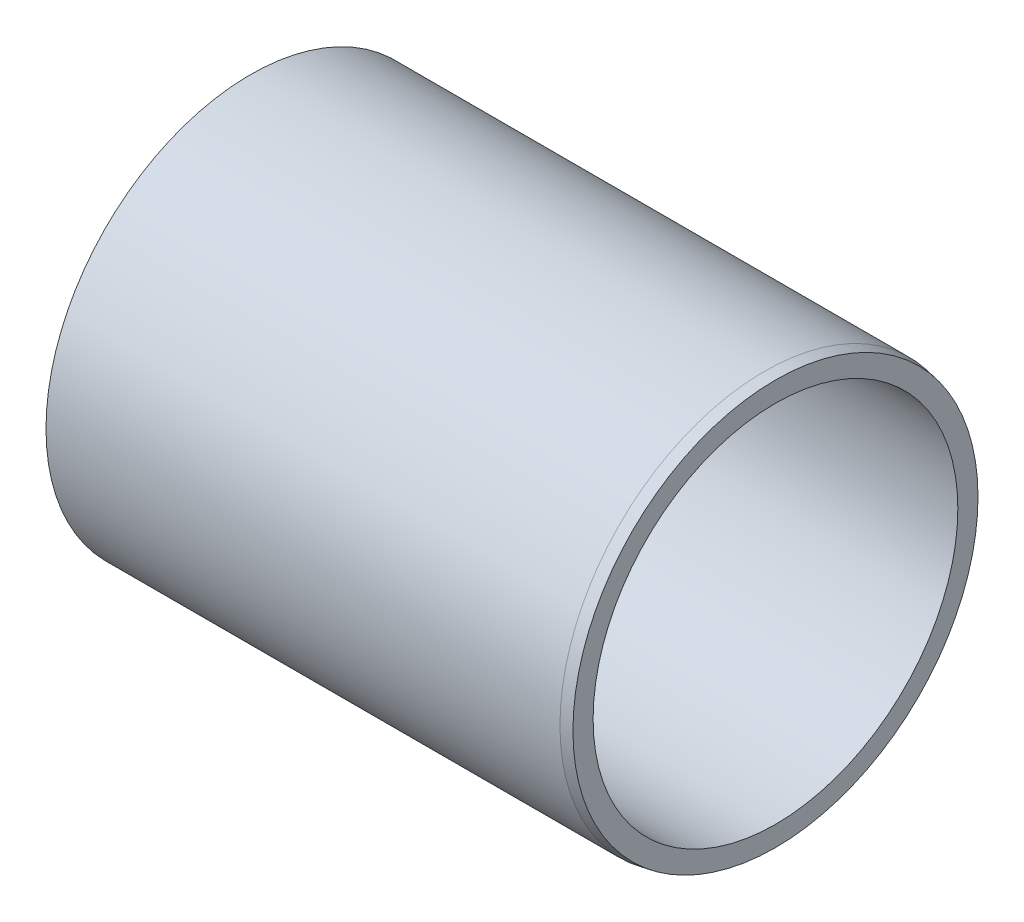
ISO-10303-21;
HEADER;
FILE_DESCRIPTION(('STEP AP214'),'2;1');
FILE_NAME('part.step','',(''),(''),'','','');
FILE_SCHEMA(('AUTOMOTIVE_DESIGN { 1 0 10303 214 1 1 1 1 }'));
ENDSEC;
DATA;
#1=APPLICATION_CONTEXT('core data for automotive mechanical design processes');
#2=APPLICATION_PROTOCOL_DEFINITION('international standard','automotive_design',2000,#1);
#3=PRODUCT_CONTEXT('',#1,'mechanical');
#4=PRODUCT('Part','Part','',(#3));
#5=PRODUCT_RELATED_PRODUCT_CATEGORY('part','',(#4));
#6=PRODUCT_DEFINITION_FORMATION('','',#4);
#7=PRODUCT_DEFINITION_CONTEXT('part definition',#1,'design');
#8=PRODUCT_DEFINITION('design','',#6,#7);
#9=PRODUCT_DEFINITION_SHAPE('','',#8);
#10=(LENGTH_UNIT() NAMED_UNIT(*) SI_UNIT(.MILLI.,.METRE.));
#11=(NAMED_UNIT(*) PLANE_ANGLE_UNIT() SI_UNIT($,.RADIAN.));
#12=(NAMED_UNIT(*) SI_UNIT($,.STERADIAN.) SOLID_ANGLE_UNIT());
#13=UNCERTAINTY_MEASURE_WITH_UNIT(LENGTH_MEASURE(1.E-05),#10,'distance_accuracy_value','');
#14=(GEOMETRIC_REPRESENTATION_CONTEXT(3) GLOBAL_UNCERTAINTY_ASSIGNED_CONTEXT((#13)) GLOBAL_UNIT_ASSIGNED_CONTEXT((#10,
#11,#12)) REPRESENTATION_CONTEXT('',''));
#15=CARTESIAN_POINT('',(0.,0.,0.));
#16=DIRECTION('',(0.,0.,1.));
#17=DIRECTION('',(1.,0.,0.));
#18=AXIS2_PLACEMENT_3D('',#15,#16,#17);
#19=CARTESIAN_POINT('',(0.,33.,0.));
#20=DIRECTION('',(1.,0.,0.));
#21=DIRECTION('',(0.,0.,-1.));
#22=AXIS2_PLACEMENT_3D('',#19,#20,#21);
#23=PLANE('',#22);
#24=CARTESIAN_POINT('',(0.,0.,0.));
#25=DIRECTION('',(-1.,0.,0.));
#26=DIRECTION('',(0.,0.,1.));
#27=AXIS2_PLACEMENT_3D('',#24,#25,#26);
#28=CIRCLE('',#27,33.);
#29=CARTESIAN_POINT('',(0.,0.,33.));
#30=VERTEX_POINT('',#29);
#31=EDGE_CURVE('E55',#30,#30,#28,.T.);
#32=ORIENTED_EDGE('',*,*,#31,.F.);
#33=EDGE_LOOP('',(#32));
#34=FACE_BOUND('',#33,.T.);
#35=CARTESIAN_POINT('',(0.,0.,0.));
#36=DIRECTION('',(-1.,0.,0.));
#37=DIRECTION('',(0.,0.,1.));
#38=AXIS2_PLACEMENT_3D('',#35,#36,#37);
#39=CIRCLE('',#38,37.);
#40=CARTESIAN_POINT('',(0.,0.,37.));
#41=VERTEX_POINT('',#40);
#42=EDGE_CURVE('E10',#41,#41,#39,.T.);
#43=ORIENTED_EDGE('',*,*,#42,.T.);
#44=EDGE_LOOP('',(#43));
#45=FACE_BOUND('',#44,.T.);
#46=ADVANCED_FACE('F36',(#34,#45),#23,.F.);
#47=CARTESIAN_POINT('',(0.,0.,0.));
#48=DIRECTION('',(-1.,0.,0.));
#49=DIRECTION('',(0.,0.,1.));
#50=AXIS2_PLACEMENT_3D('',#47,#48,#49);
#51=CYLINDRICAL_SURFACE('',#50,37.);
#52=ORIENTED_EDGE('',*,*,#42,.F.);
#53=EDGE_LOOP('',(#52));
#54=FACE_BOUND('',#53,.T.);
#55=CARTESIAN_POINT('',(93.,0.,0.));
#56=DIRECTION('',(-1.,0.,0.));
#57=DIRECTION('',(0.,0.,1.));
#58=AXIS2_PLACEMENT_3D('',#55,#56,#57);
#59=CIRCLE('',#58,37.);
#60=CARTESIAN_POINT('',(93.,0.,37.));
#61=VERTEX_POINT('',#60);
#62=EDGE_CURVE('E42',#61,#61,#59,.T.);
#63=ORIENTED_EDGE('',*,*,#62,.T.);
#64=EDGE_LOOP('',(#63));
#65=FACE_BOUND('',#64,.T.);
#66=ADVANCED_FACE('F62',(#54,#65),#51,.T.);
#67=CARTESIAN_POINT('',(95.,0.,0.));
#68=DIRECTION('',(-1.,0.,0.));
#69=DIRECTION('',(0.,0.,1.));
#70=AXIS2_PLACEMENT_3D('',#67,#68,#69);
#71=CONICAL_SURFACE('',#70,36.6473460385831,0.174532925199435);
#72=ORIENTED_EDGE('',*,*,#62,.F.);
#73=EDGE_LOOP('',(#72));
#74=FACE_BOUND('',#73,.T.);
#75=CARTESIAN_POINT('',(95.,0.,0.));
#76=DIRECTION('',(-1.,0.,0.));
#77=DIRECTION('',(0.,0.,1.));
#78=AXIS2_PLACEMENT_3D('',#75,#76,#77);
#79=CIRCLE('',#78,36.6473460385831);
#80=CARTESIAN_POINT('',(95.,0.,36.6473460385831));
#81=VERTEX_POINT('',#80);
#82=EDGE_CURVE('E46',#81,#81,#79,.T.);
#83=ORIENTED_EDGE('',*,*,#82,.T.);
#84=EDGE_LOOP('',(#83));
#85=FACE_BOUND('',#84,.T.);
#86=ADVANCED_FACE('F66',(#74,#85),#71,.T.);
#87=CARTESIAN_POINT('',(95.,33.,0.));
#88=DIRECTION('',(-1.,0.,0.));
#89=DIRECTION('',(0.,0.,1.));
#90=AXIS2_PLACEMENT_3D('',#87,#88,#89);
#91=PLANE('',#90);
#92=ORIENTED_EDGE('',*,*,#82,.F.);
#93=EDGE_LOOP('',(#92));
#94=FACE_BOUND('',#93,.T.);
#95=CARTESIAN_POINT('',(95.,0.,0.));
#96=DIRECTION('',(-1.,0.,0.));
#97=DIRECTION('',(0.,0.,1.));
#98=AXIS2_PLACEMENT_3D('',#95,#96,#97);
#99=CIRCLE('',#98,33.);
#100=CARTESIAN_POINT('',(95.,0.,33.));
#101=VERTEX_POINT('',#100);
#102=EDGE_CURVE('E50',#101,#101,#99,.T.);
#103=ORIENTED_EDGE('',*,*,#102,.T.);
#104=EDGE_LOOP('',(#103));
#105=FACE_BOUND('',#104,.T.);
#106=ADVANCED_FACE('F71',(#94,#105),#91,.F.);
#107=CARTESIAN_POINT('',(0.,0.,0.));
#108=DIRECTION('',(-1.,0.,0.));
#109=DIRECTION('',(0.,0.,1.));
#110=AXIS2_PLACEMENT_3D('',#107,#108,#109);
#111=CYLINDRICAL_SURFACE('',#110,33.);
#112=ORIENTED_EDGE('',*,*,#102,.F.);
#113=EDGE_LOOP('',(#112));
#114=FACE_BOUND('',#113,.T.);
#115=ORIENTED_EDGE('',*,*,#31,.T.);
#116=EDGE_LOOP('',(#115));
#117=FACE_BOUND('',#116,.T.);
#118=ADVANCED_FACE('F59',(#114,#117),#111,.F.);
#119=CLOSED_SHELL('',(#46,#66,#86,#106,#118));
#120=MANIFOLD_SOLID_BREP('B2',#119);
#121=ADVANCED_BREP_SHAPE_REPRESENTATION('',(#18,#120),#14);
#122=SHAPE_DEFINITION_REPRESENTATION(#9,#121);
ENDSEC;
END-ISO-10303-21;
